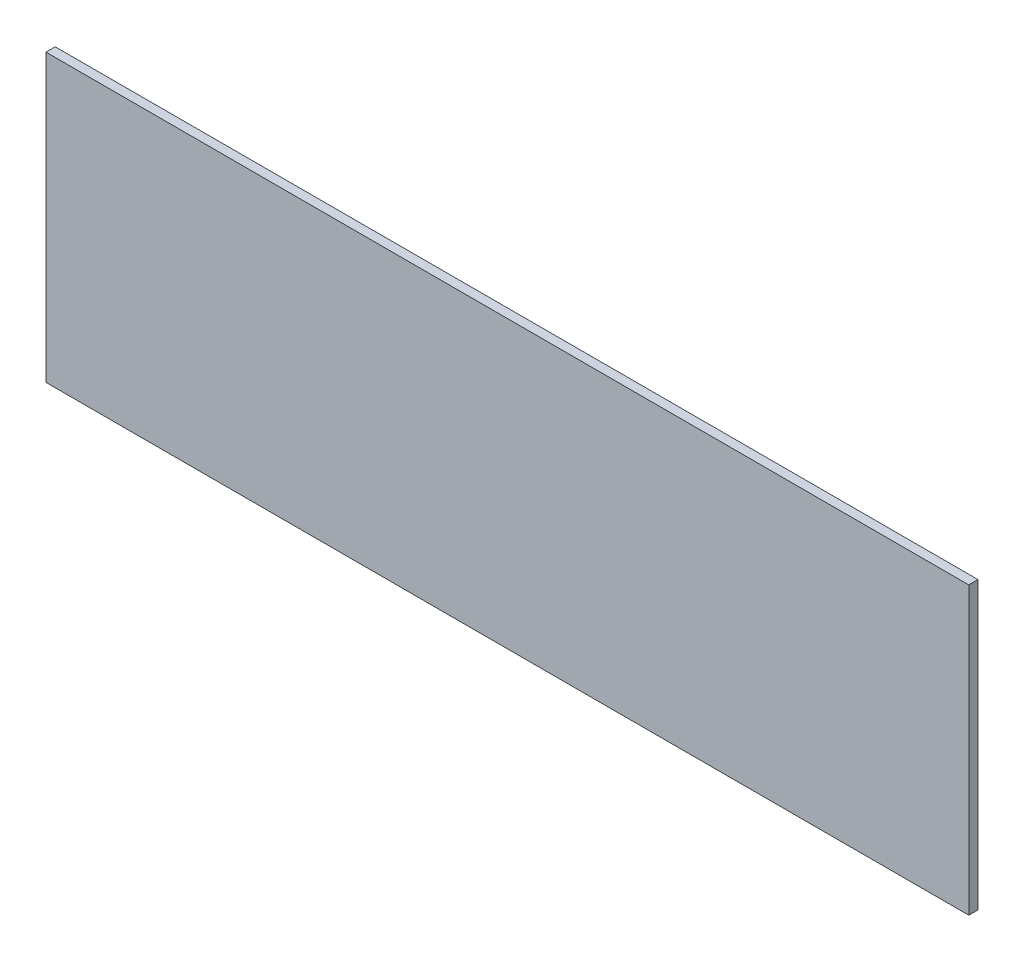
ISO-10303-21;
HEADER;
FILE_DESCRIPTION(('STEP AP214'),'2;1');
FILE_NAME('part.step','',(''),(''),'','','');
FILE_SCHEMA(('AUTOMOTIVE_DESIGN { 1 0 10303 214 1 1 1 1 }'));
ENDSEC;
DATA;
#1=APPLICATION_CONTEXT('core data for automotive mechanical design processes');
#2=APPLICATION_PROTOCOL_DEFINITION('international standard','automotive_design',2000,#1);
#3=PRODUCT_CONTEXT('',#1,'mechanical');
#4=PRODUCT('Part','Part','',(#3));
#5=PRODUCT_RELATED_PRODUCT_CATEGORY('part','',(#4));
#6=PRODUCT_DEFINITION_FORMATION('','',#4);
#7=PRODUCT_DEFINITION_CONTEXT('part definition',#1,'design');
#8=PRODUCT_DEFINITION('design','',#6,#7);
#9=PRODUCT_DEFINITION_SHAPE('','',#8);
#10=(LENGTH_UNIT() NAMED_UNIT(*) SI_UNIT(.MILLI.,.METRE.));
#11=(NAMED_UNIT(*) PLANE_ANGLE_UNIT() SI_UNIT($,.RADIAN.));
#12=(NAMED_UNIT(*) SI_UNIT($,.STERADIAN.) SOLID_ANGLE_UNIT());
#13=UNCERTAINTY_MEASURE_WITH_UNIT(LENGTH_MEASURE(1.E-05),#10,'distance_accuracy_value','');
#14=(GEOMETRIC_REPRESENTATION_CONTEXT(3) GLOBAL_UNCERTAINTY_ASSIGNED_CONTEXT((#13)) GLOBAL_UNIT_ASSIGNED_CONTEXT((#10,
#11,#12)) REPRESENTATION_CONTEXT('',''));
#15=CARTESIAN_POINT('',(0.,0.,0.));
#16=DIRECTION('',(0.,0.,1.));
#17=DIRECTION('',(1.,0.,0.));
#18=AXIS2_PLACEMENT_3D('',#15,#16,#17);
#19=CARTESIAN_POINT('',(178.,0.,3.));
#20=DIRECTION('',(0.,-1.,0.));
#21=DIRECTION('',(1.,0.,0.));
#22=AXIS2_PLACEMENT_3D('',#19,#20,#21);
#23=PLANE('',#22);
#24=DIRECTION('',(-1.,0.,0.));
#25=VECTOR('',#24,1.);
#26=CARTESIAN_POINT('',(178.,0.,0.));
#27=LINE('',#26,#25);
#28=CARTESIAN_POINT('',(178.,0.,0.));
#29=VERTEX_POINT('',#28);
#30=CARTESIAN_POINT('',(-122.,0.,0.));
#31=VERTEX_POINT('',#30);
#32=EDGE_CURVE('E96',#29,#31,#27,.T.);
#33=ORIENTED_EDGE('',*,*,#32,.T.);
#34=DIRECTION('',(0.,0.,-1.));
#35=VECTOR('',#34,1.);
#36=CARTESIAN_POINT('',(-122.,0.,3.));
#37=LINE('',#36,#35);
#38=CARTESIAN_POINT('',(-122.,0.,3.));
#39=VERTEX_POINT('',#38);
#40=EDGE_CURVE('E11',#39,#31,#37,.T.);
#41=ORIENTED_EDGE('',*,*,#40,.F.);
#42=DIRECTION('',(-1.,0.,0.));
#43=VECTOR('',#42,1.);
#44=CARTESIAN_POINT('',(178.,0.,3.));
#45=LINE('',#44,#43);
#46=CARTESIAN_POINT('',(178.,0.,3.));
#47=VERTEX_POINT('',#46);
#48=EDGE_CURVE('E82',#47,#39,#45,.T.);
#49=ORIENTED_EDGE('',*,*,#48,.F.);
#50=DIRECTION('',(0.,0.,-1.));
#51=VECTOR('',#50,1.);
#52=CARTESIAN_POINT('',(178.,0.,3.));
#53=LINE('',#52,#51);
#54=EDGE_CURVE('E92',#47,#29,#53,.T.);
#55=ORIENTED_EDGE('',*,*,#54,.T.);
#56=EDGE_LOOP('',(#33,#41,#49,#55));
#57=FACE_BOUND('',#56,.T.);
#58=ADVANCED_FACE('F32',(#57),#23,.F.);
#59=CARTESIAN_POINT('',(-122.,-2.99999999999999,3.));
#60=DIRECTION('',(1.,0.,0.));
#61=DIRECTION('',(0.,1.,0.));
#62=AXIS2_PLACEMENT_3D('',#59,#60,#61);
#63=PLANE('',#62);
#64=DIRECTION('',(0.,-1.,0.));
#65=VECTOR('',#64,1.);
#66=CARTESIAN_POINT('',(-122.,-2.99999999999999,0.));
#67=LINE('',#66,#65);
#68=CARTESIAN_POINT('',(-122.,-93.,0.));
#69=VERTEX_POINT('',#68);
#70=EDGE_CURVE('E87',#31,#69,#67,.T.);
#71=ORIENTED_EDGE('',*,*,#70,.T.);
#72=DIRECTION('',(0.,0.,-1.));
#73=VECTOR('',#72,1.);
#74=CARTESIAN_POINT('',(-122.,-93.,3.));
#75=LINE('',#74,#73);
#76=CARTESIAN_POINT('',(-122.,-93.,3.));
#77=VERTEX_POINT('',#76);
#78=EDGE_CURVE('E40',#77,#69,#75,.T.);
#79=ORIENTED_EDGE('',*,*,#78,.F.);
#80=DIRECTION('',(0.,-1.,0.));
#81=VECTOR('',#80,1.);
#82=CARTESIAN_POINT('',(-122.,0.,3.));
#83=LINE('',#82,#81);
#84=EDGE_CURVE('E76',#39,#77,#83,.T.);
#85=ORIENTED_EDGE('',*,*,#84,.F.);
#86=ORIENTED_EDGE('',*,*,#40,.T.);
#87=EDGE_LOOP('',(#71,#79,#85,#86));
#88=FACE_BOUND('',#87,.T.);
#89=ADVANCED_FACE('F86',(#88),#63,.F.);
#90=CARTESIAN_POINT('',(-122.,-93.,3.));
#91=DIRECTION('',(0.,1.,0.));
#92=DIRECTION('',(0.,0.,1.));
#93=AXIS2_PLACEMENT_3D('',#90,#91,#92);
#94=PLANE('',#93);
#95=DIRECTION('',(1.,0.,0.));
#96=VECTOR('',#95,1.);
#97=CARTESIAN_POINT('',(-122.,-93.,0.));
#98=LINE('',#97,#96);
#99=CARTESIAN_POINT('',(178.,-93.,0.));
#100=VERTEX_POINT('',#99);
#101=EDGE_CURVE('E100',#69,#100,#98,.T.);
#102=ORIENTED_EDGE('',*,*,#101,.T.);
#103=DIRECTION('',(0.,0.,-1.));
#104=VECTOR('',#103,1.);
#105=CARTESIAN_POINT('',(178.,-93.,3.));
#106=LINE('',#105,#104);
#107=CARTESIAN_POINT('',(178.,-93.,3.));
#108=VERTEX_POINT('',#107);
#109=EDGE_CURVE('E89',#108,#100,#106,.T.);
#110=ORIENTED_EDGE('',*,*,#109,.F.);
#111=DIRECTION('',(1.,0.,0.));
#112=VECTOR('',#111,1.);
#113=CARTESIAN_POINT('',(-122.,-93.,3.));
#114=LINE('',#113,#112);
#115=EDGE_CURVE('E79',#77,#108,#114,.T.);
#116=ORIENTED_EDGE('',*,*,#115,.F.);
#117=ORIENTED_EDGE('',*,*,#78,.T.);
#118=EDGE_LOOP('',(#102,#110,#116,#117));
#119=FACE_BOUND('',#118,.T.);
#120=ADVANCED_FACE('F90',(#119),#94,.F.);
#121=CARTESIAN_POINT('',(178.,-2.99999999999992,3.));
#122=DIRECTION('',(-1.,0.,0.));
#123=DIRECTION('',(0.,0.,1.));
#124=AXIS2_PLACEMENT_3D('',#121,#122,#123);
#125=PLANE('',#124);
#126=DIRECTION('',(0.,1.,0.));
#127=VECTOR('',#126,1.);
#128=CARTESIAN_POINT('',(178.,-2.99999999999992,0.));
#129=LINE('',#128,#127);
#130=EDGE_CURVE('E65',#100,#29,#129,.T.);
#131=ORIENTED_EDGE('',*,*,#130,.T.);
#132=ORIENTED_EDGE('',*,*,#54,.F.);
#133=DIRECTION('',(0.,1.,0.));
#134=VECTOR('',#133,1.);
#135=CARTESIAN_POINT('',(178.,-93.,3.));
#136=LINE('',#135,#134);
#137=EDGE_CURVE('E48',#108,#47,#136,.T.);
#138=ORIENTED_EDGE('',*,*,#137,.F.);
#139=ORIENTED_EDGE('',*,*,#109,.T.);
#140=EDGE_LOOP('',(#131,#132,#138,#139));
#141=FACE_BOUND('',#140,.T.);
#142=ADVANCED_FACE('F104',(#141),#125,.F.);
#143=CARTESIAN_POINT('',(0.,0.,3.));
#144=DIRECTION('',(0.,0.,1.));
#145=DIRECTION('',(1.,0.,0.));
#146=AXIS2_PLACEMENT_3D('',#143,#144,#145);
#147=PLANE('',#146);
#148=ORIENTED_EDGE('',*,*,#48,.T.);
#149=ORIENTED_EDGE('',*,*,#84,.T.);
#150=ORIENTED_EDGE('',*,*,#115,.T.);
#151=ORIENTED_EDGE('',*,*,#137,.T.);
#152=EDGE_LOOP('',(#148,#149,#150,#151));
#153=FACE_BOUND('',#152,.T.);
#154=ADVANCED_FACE('F77',(#153),#147,.T.);
#155=CARTESIAN_POINT('',(0.,0.,0.));
#156=DIRECTION('',(0.,0.,1.));
#157=DIRECTION('',(1.,0.,0.));
#158=AXIS2_PLACEMENT_3D('',#155,#156,#157);
#159=PLANE('',#158);
#160=ORIENTED_EDGE('',*,*,#32,.F.);
#161=ORIENTED_EDGE('',*,*,#130,.F.);
#162=ORIENTED_EDGE('',*,*,#101,.F.);
#163=ORIENTED_EDGE('',*,*,#70,.F.);
#164=EDGE_LOOP('',(#160,#161,#162,#163));
#165=FACE_BOUND('',#164,.T.);
#166=ADVANCED_FACE('F106',(#165),#159,.F.);
#167=CLOSED_SHELL('',(#58,#89,#120,#142,#154,#166));
#168=MANIFOLD_SOLID_BREP('B2',#167);
#169=ADVANCED_BREP_SHAPE_REPRESENTATION('',(#18,#168),#14);
#170=SHAPE_DEFINITION_REPRESENTATION(#9,#169);
ENDSEC;
END-ISO-10303-21;
